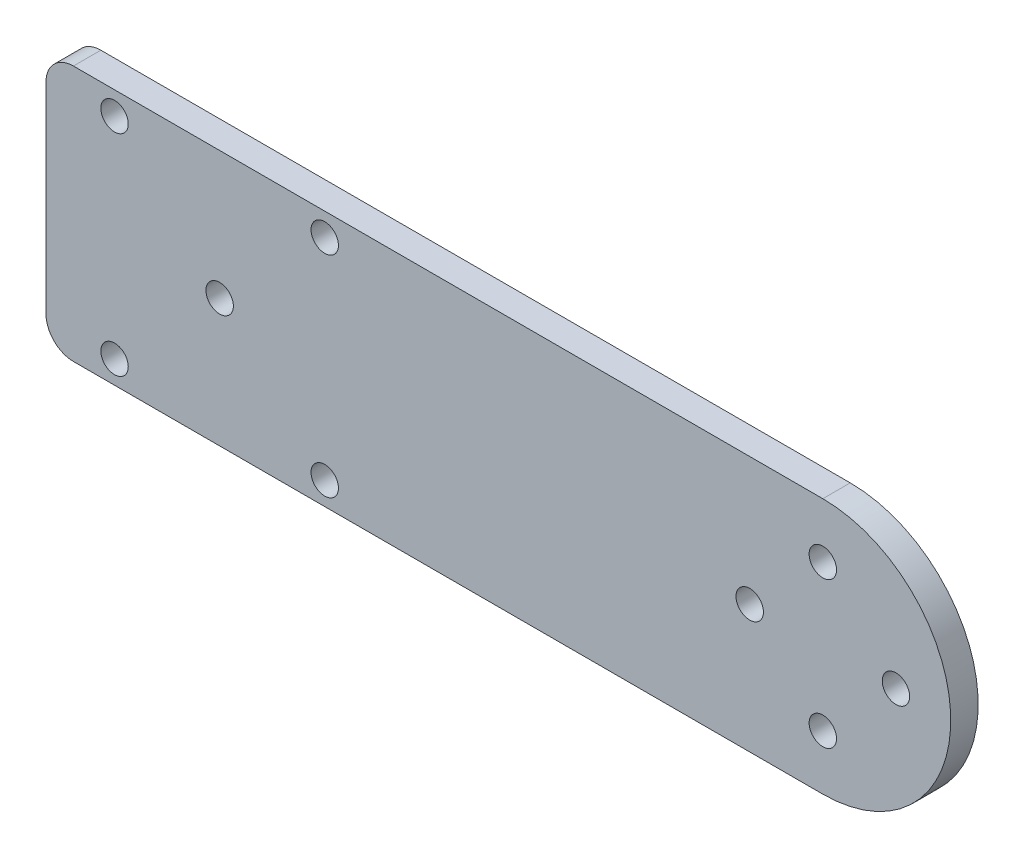
ISO-10303-21;
HEADER;
FILE_DESCRIPTION(('STEP AP214'),'2;1');
FILE_NAME('part.step','',(''),(''),'','','');
FILE_SCHEMA(('AUTOMOTIVE_DESIGN { 1 0 10303 214 1 1 1 1 }'));
ENDSEC;
DATA;
#1=APPLICATION_CONTEXT('core data for automotive mechanical design processes');
#2=APPLICATION_PROTOCOL_DEFINITION('international standard','automotive_design',2000,#1);
#3=PRODUCT_CONTEXT('',#1,'mechanical');
#4=PRODUCT('Part','Part','',(#3));
#5=PRODUCT_RELATED_PRODUCT_CATEGORY('part','',(#4));
#6=PRODUCT_DEFINITION_FORMATION('','',#4);
#7=PRODUCT_DEFINITION_CONTEXT('part definition',#1,'design');
#8=PRODUCT_DEFINITION('design','',#6,#7);
#9=PRODUCT_DEFINITION_SHAPE('','',#8);
#10=(LENGTH_UNIT() NAMED_UNIT(*) SI_UNIT(.MILLI.,.METRE.));
#11=(NAMED_UNIT(*) PLANE_ANGLE_UNIT() SI_UNIT($,.RADIAN.));
#12=(NAMED_UNIT(*) SI_UNIT($,.STERADIAN.) SOLID_ANGLE_UNIT());
#13=UNCERTAINTY_MEASURE_WITH_UNIT(LENGTH_MEASURE(1.E-05),#10,'distance_accuracy_value','');
#14=(GEOMETRIC_REPRESENTATION_CONTEXT(3) GLOBAL_UNCERTAINTY_ASSIGNED_CONTEXT((#13)) GLOBAL_UNIT_ASSIGNED_CONTEXT((#10,
#11,#12)) REPRESENTATION_CONTEXT('',''));
#15=CARTESIAN_POINT('',(0.,0.,0.));
#16=DIRECTION('',(0.,0.,1.));
#17=DIRECTION('',(1.,0.,0.));
#18=AXIS2_PLACEMENT_3D('',#15,#16,#17);
#19=CARTESIAN_POINT('',(0.,-14.,3.));
#20=DIRECTION('',(0.,-1.,0.));
#21=DIRECTION('',(1.,0.,0.));
#22=AXIS2_PLACEMENT_3D('',#19,#20,#21);
#23=PLANE('',#22);
#24=DIRECTION('',(-1.,0.,0.));
#25=VECTOR('',#24,1.);
#26=CARTESIAN_POINT('',(0.,-14.,3.));
#27=LINE('',#26,#25);
#28=CARTESIAN_POINT('',(0.,-14.,3.));
#29=VERTEX_POINT('',#28);
#30=CARTESIAN_POINT('',(-82.,-14.,3.));
#31=VERTEX_POINT('',#30);
#32=EDGE_CURVE('E124',#29,#31,#27,.T.);
#33=ORIENTED_EDGE('',*,*,#32,.T.);
#34=DIRECTION('',(0.,0.,-1.));
#35=VECTOR('',#34,1.);
#36=CARTESIAN_POINT('',(-82.,-14.,0.));
#37=LINE('',#36,#35);
#38=CARTESIAN_POINT('',(-82.,-14.,0.));
#39=VERTEX_POINT('',#38);
#40=EDGE_CURVE('E132',#31,#39,#37,.T.);
#41=ORIENTED_EDGE('',*,*,#40,.T.);
#42=DIRECTION('',(-1.,0.,0.));
#43=VECTOR('',#42,1.);
#44=CARTESIAN_POINT('',(0.,-14.,0.));
#45=LINE('',#44,#43);
#46=CARTESIAN_POINT('',(0.,-14.,0.));
#47=VERTEX_POINT('',#46);
#48=EDGE_CURVE('E127',#47,#39,#45,.T.);
#49=ORIENTED_EDGE('',*,*,#48,.F.);
#50=DIRECTION('',(0.,0.,-1.));
#51=VECTOR('',#50,1.);
#52=CARTESIAN_POINT('',(0.,-14.,3.));
#53=LINE('',#52,#51);
#54=EDGE_CURVE('E120',#29,#47,#53,.T.);
#55=ORIENTED_EDGE('',*,*,#54,.F.);
#56=EDGE_LOOP('',(#33,#41,#49,#55));
#57=FACE_BOUND('',#56,.T.);
#58=ADVANCED_FACE('F65',(#57),#23,.T.);
#59=CARTESIAN_POINT('',(0.,0.,3.));
#60=DIRECTION('',(0.,0.,-1.));
#61=DIRECTION('',(-1.,0.,0.));
#62=AXIS2_PLACEMENT_3D('',#59,#60,#61);
#63=CYLINDRICAL_SURFACE('',#62,14.);
#64=CARTESIAN_POINT('',(0.,0.,0.));
#65=DIRECTION('',(0.,0.,1.));
#66=DIRECTION('',(1.,0.,0.));
#67=AXIS2_PLACEMENT_3D('',#64,#65,#66);
#68=CIRCLE('',#67,14.);
#69=CARTESIAN_POINT('',(0.,14.,0.));
#70=VERTEX_POINT('',#69);
#71=EDGE_CURVE('E197',#47,#70,#68,.T.);
#72=ORIENTED_EDGE('',*,*,#71,.T.);
#73=DIRECTION('',(0.,0.,-1.));
#74=VECTOR('',#73,1.);
#75=CARTESIAN_POINT('',(0.,14.,3.));
#76=LINE('',#75,#74);
#77=CARTESIAN_POINT('',(0.,14.,3.));
#78=VERTEX_POINT('',#77);
#79=EDGE_CURVE('E133',#78,#70,#76,.T.);
#80=ORIENTED_EDGE('',*,*,#79,.F.);
#81=CARTESIAN_POINT('',(0.,0.,3.));
#82=DIRECTION('',(0.,0.,1.));
#83=DIRECTION('',(1.,0.,0.));
#84=AXIS2_PLACEMENT_3D('',#81,#82,#83);
#85=CIRCLE('',#84,14.);
#86=EDGE_CURVE('E137',#29,#78,#85,.T.);
#87=ORIENTED_EDGE('',*,*,#86,.F.);
#88=ORIENTED_EDGE('',*,*,#54,.T.);
#89=EDGE_LOOP('',(#72,#80,#87,#88));
#90=FACE_BOUND('',#89,.T.);
#91=ADVANCED_FACE('F138',(#90),#63,.T.);
#92=CARTESIAN_POINT('',(0.,14.,3.));
#93=DIRECTION('',(0.,-1.,0.));
#94=DIRECTION('',(1.,0.,0.));
#95=AXIS2_PLACEMENT_3D('',#92,#93,#94);
#96=PLANE('',#95);
#97=DIRECTION('',(-1.,0.,0.));
#98=VECTOR('',#97,1.);
#99=CARTESIAN_POINT('',(0.,14.,0.));
#100=LINE('',#99,#98);
#101=CARTESIAN_POINT('',(-82.,14.,0.));
#102=VERTEX_POINT('',#101);
#103=EDGE_CURVE('E200',#70,#102,#100,.T.);
#104=ORIENTED_EDGE('',*,*,#103,.T.);
#105=DIRECTION('',(0.,0.,-1.));
#106=VECTOR('',#105,1.);
#107=CARTESIAN_POINT('',(-82.,14.,3.));
#108=LINE('',#107,#106);
#109=CARTESIAN_POINT('',(-82.,14.,3.));
#110=VERTEX_POINT('',#109);
#111=EDGE_CURVE('E12',#102,#110,#108,.F.);
#112=ORIENTED_EDGE('',*,*,#111,.T.);
#113=DIRECTION('',(-1.,0.,0.));
#114=VECTOR('',#113,1.);
#115=CARTESIAN_POINT('',(0.,14.,3.));
#116=LINE('',#115,#114);
#117=EDGE_CURVE('E142',#78,#110,#116,.T.);
#118=ORIENTED_EDGE('',*,*,#117,.F.);
#119=ORIENTED_EDGE('',*,*,#79,.T.);
#120=EDGE_LOOP('',(#104,#112,#118,#119));
#121=FACE_BOUND('',#120,.T.);
#122=ADVANCED_FACE('F260',(#121),#96,.F.);
#123=CARTESIAN_POINT('',(-77.5,-11.5,3.));
#124=DIRECTION('',(0.,0.,-1.));
#125=DIRECTION('',(-1.,0.,0.));
#126=AXIS2_PLACEMENT_3D('',#123,#124,#125);
#127=CYLINDRICAL_SURFACE('',#126,1.5);
#128=CARTESIAN_POINT('',(-77.5,-11.5,3.));
#129=DIRECTION('',(0.,0.,1.));
#130=DIRECTION('',(1.,0.,0.));
#131=AXIS2_PLACEMENT_3D('',#128,#129,#130);
#132=CIRCLE('',#131,1.5);
#133=CARTESIAN_POINT('',(-76.,-11.5,3.));
#134=VERTEX_POINT('',#133);
#135=EDGE_CURVE('E174',#134,#134,#132,.T.);
#136=ORIENTED_EDGE('',*,*,#135,.T.);
#137=EDGE_LOOP('',(#136));
#138=FACE_BOUND('',#137,.T.);
#139=CARTESIAN_POINT('',(-77.5,-11.5,0.));
#140=DIRECTION('',(0.,0.,1.));
#141=DIRECTION('',(1.,0.,0.));
#142=AXIS2_PLACEMENT_3D('',#139,#140,#141);
#143=CIRCLE('',#142,1.5);
#144=CARTESIAN_POINT('',(-76.,-11.5,0.));
#145=VERTEX_POINT('',#144);
#146=EDGE_CURVE('E219',#145,#145,#143,.T.);
#147=ORIENTED_EDGE('',*,*,#146,.F.);
#148=EDGE_LOOP('',(#147));
#149=FACE_BOUND('',#148,.T.);
#150=ADVANCED_FACE('F284',(#138,#149),#127,.F.);
#151=CARTESIAN_POINT('',(-54.5,11.5,3.));
#152=DIRECTION('',(0.,0.,-1.));
#153=DIRECTION('',(-1.,0.,0.));
#154=AXIS2_PLACEMENT_3D('',#151,#152,#153);
#155=CYLINDRICAL_SURFACE('',#154,1.5);
#156=CARTESIAN_POINT('',(-54.5,11.5,3.));
#157=DIRECTION('',(0.,0.,1.));
#158=DIRECTION('',(1.,0.,0.));
#159=AXIS2_PLACEMENT_3D('',#156,#157,#158);
#160=CIRCLE('',#159,1.5);
#161=CARTESIAN_POINT('',(-53.,11.5,3.));
#162=VERTEX_POINT('',#161);
#163=EDGE_CURVE('E170',#162,#162,#160,.T.);
#164=ORIENTED_EDGE('',*,*,#163,.T.);
#165=EDGE_LOOP('',(#164));
#166=FACE_BOUND('',#165,.T.);
#167=CARTESIAN_POINT('',(-54.5,11.5,0.));
#168=DIRECTION('',(0.,0.,1.));
#169=DIRECTION('',(1.,0.,0.));
#170=AXIS2_PLACEMENT_3D('',#167,#168,#169);
#171=CIRCLE('',#170,1.5);
#172=CARTESIAN_POINT('',(-53.,11.5,0.));
#173=VERTEX_POINT('',#172);
#174=EDGE_CURVE('E215',#173,#173,#171,.T.);
#175=ORIENTED_EDGE('',*,*,#174,.F.);
#176=EDGE_LOOP('',(#175));
#177=FACE_BOUND('',#176,.T.);
#178=ADVANCED_FACE('F287',(#166,#177),#155,.F.);
#179=CARTESIAN_POINT('',(-54.5,-11.5,3.));
#180=DIRECTION('',(0.,0.,-1.));
#181=DIRECTION('',(-1.,0.,0.));
#182=AXIS2_PLACEMENT_3D('',#179,#180,#181);
#183=CYLINDRICAL_SURFACE('',#182,1.5);
#184=CARTESIAN_POINT('',(-54.5,-11.5,3.));
#185=DIRECTION('',(0.,0.,1.));
#186=DIRECTION('',(1.,0.,0.));
#187=AXIS2_PLACEMENT_3D('',#184,#185,#186);
#188=CIRCLE('',#187,1.5);
#189=CARTESIAN_POINT('',(-53.,-11.5,3.));
#190=VERTEX_POINT('',#189);
#191=EDGE_CURVE('E166',#190,#190,#188,.T.);
#192=ORIENTED_EDGE('',*,*,#191,.T.);
#193=EDGE_LOOP('',(#192));
#194=FACE_BOUND('',#193,.T.);
#195=CARTESIAN_POINT('',(-54.5,-11.5,0.));
#196=DIRECTION('',(0.,0.,1.));
#197=DIRECTION('',(1.,0.,0.));
#198=AXIS2_PLACEMENT_3D('',#195,#196,#197);
#199=CIRCLE('',#198,1.5);
#200=CARTESIAN_POINT('',(-53.,-11.5,0.));
#201=VERTEX_POINT('',#200);
#202=EDGE_CURVE('E211',#201,#201,#199,.T.);
#203=ORIENTED_EDGE('',*,*,#202,.F.);
#204=EDGE_LOOP('',(#203));
#205=FACE_BOUND('',#204,.T.);
#206=ADVANCED_FACE('F291',(#194,#205),#183,.F.);
#207=CARTESIAN_POINT('',(-66.,0.,3.));
#208=DIRECTION('',(0.,0.,-1.));
#209=DIRECTION('',(-1.,0.,0.));
#210=AXIS2_PLACEMENT_3D('',#207,#208,#209);
#211=CYLINDRICAL_SURFACE('',#210,1.5);
#212=CARTESIAN_POINT('',(-66.,0.,3.));
#213=DIRECTION('',(0.,0.,1.));
#214=DIRECTION('',(1.,0.,0.));
#215=AXIS2_PLACEMENT_3D('',#212,#213,#214);
#216=CIRCLE('',#215,1.5);
#217=CARTESIAN_POINT('',(-64.5,0.,3.));
#218=VERTEX_POINT('',#217);
#219=EDGE_CURVE('E162',#218,#218,#216,.T.);
#220=ORIENTED_EDGE('',*,*,#219,.T.);
#221=EDGE_LOOP('',(#220));
#222=FACE_BOUND('',#221,.T.);
#223=CARTESIAN_POINT('',(-66.,0.,0.));
#224=DIRECTION('',(0.,0.,1.));
#225=DIRECTION('',(1.,0.,0.));
#226=AXIS2_PLACEMENT_3D('',#223,#224,#225);
#227=CIRCLE('',#226,1.5);
#228=CARTESIAN_POINT('',(-64.5,0.,0.));
#229=VERTEX_POINT('',#228);
#230=EDGE_CURVE('E207',#229,#229,#227,.T.);
#231=ORIENTED_EDGE('',*,*,#230,.F.);
#232=EDGE_LOOP('',(#231));
#233=FACE_BOUND('',#232,.T.);
#234=ADVANCED_FACE('F295',(#222,#233),#211,.F.);
#235=CARTESIAN_POINT('',(0.,8.,3.));
#236=DIRECTION('',(0.,0.,-1.));
#237=DIRECTION('',(-1.,0.,0.));
#238=AXIS2_PLACEMENT_3D('',#235,#236,#237);
#239=CYLINDRICAL_SURFACE('',#238,1.5);
#240=CARTESIAN_POINT('',(0.,8.,3.));
#241=DIRECTION('',(0.,0.,1.));
#242=DIRECTION('',(1.,0.,0.));
#243=AXIS2_PLACEMENT_3D('',#240,#241,#242);
#244=CIRCLE('',#243,1.5);
#245=CARTESIAN_POINT('',(1.5,8.,3.));
#246=VERTEX_POINT('',#245);
#247=EDGE_CURVE('E158',#246,#246,#244,.T.);
#248=ORIENTED_EDGE('',*,*,#247,.T.);
#249=EDGE_LOOP('',(#248));
#250=FACE_BOUND('',#249,.T.);
#251=CARTESIAN_POINT('',(0.,8.,0.));
#252=DIRECTION('',(0.,0.,1.));
#253=DIRECTION('',(1.,0.,0.));
#254=AXIS2_PLACEMENT_3D('',#251,#252,#253);
#255=CIRCLE('',#254,1.5);
#256=CARTESIAN_POINT('',(1.5,8.,0.));
#257=VERTEX_POINT('',#256);
#258=EDGE_CURVE('E203',#257,#257,#255,.T.);
#259=ORIENTED_EDGE('',*,*,#258,.F.);
#260=EDGE_LOOP('',(#259));
#261=FACE_BOUND('',#260,.T.);
#262=ADVANCED_FACE('F299',(#250,#261),#239,.F.);
#263=CARTESIAN_POINT('',(-8.,0.,3.));
#264=DIRECTION('',(0.,0.,-1.));
#265=DIRECTION('',(-1.,0.,0.));
#266=AXIS2_PLACEMENT_3D('',#263,#264,#265);
#267=CYLINDRICAL_SURFACE('',#266,1.5);
#268=CARTESIAN_POINT('',(-8.,0.,3.));
#269=DIRECTION('',(0.,0.,1.));
#270=DIRECTION('',(1.,0.,0.));
#271=AXIS2_PLACEMENT_3D('',#268,#269,#270);
#272=CIRCLE('',#271,1.5);
#273=CARTESIAN_POINT('',(-6.5,0.,3.));
#274=VERTEX_POINT('',#273);
#275=EDGE_CURVE('E148',#274,#274,#272,.T.);
#276=ORIENTED_EDGE('',*,*,#275,.T.);
#277=EDGE_LOOP('',(#276));
#278=FACE_BOUND('',#277,.T.);
#279=CARTESIAN_POINT('',(-8.,0.,0.));
#280=DIRECTION('',(0.,0.,1.));
#281=DIRECTION('',(1.,0.,0.));
#282=AXIS2_PLACEMENT_3D('',#279,#280,#281);
#283=CIRCLE('',#282,1.5);
#284=CARTESIAN_POINT('',(-6.5,0.,0.));
#285=VERTEX_POINT('',#284);
#286=EDGE_CURVE('E191',#285,#285,#283,.T.);
#287=ORIENTED_EDGE('',*,*,#286,.F.);
#288=EDGE_LOOP('',(#287));
#289=FACE_BOUND('',#288,.T.);
#290=ADVANCED_FACE('F303',(#278,#289),#267,.F.);
#291=CARTESIAN_POINT('',(0.,-8.,3.));
#292=DIRECTION('',(0.,0.,-1.));
#293=DIRECTION('',(-1.,0.,0.));
#294=AXIS2_PLACEMENT_3D('',#291,#292,#293);
#295=CYLINDRICAL_SURFACE('',#294,1.5);
#296=CARTESIAN_POINT('',(0.,-8.,3.));
#297=DIRECTION('',(0.,0.,1.));
#298=DIRECTION('',(1.,0.,0.));
#299=AXIS2_PLACEMENT_3D('',#296,#297,#298);
#300=CIRCLE('',#299,1.5);
#301=CARTESIAN_POINT('',(1.5,-8.,3.));
#302=VERTEX_POINT('',#301);
#303=EDGE_CURVE('E152',#302,#302,#300,.T.);
#304=ORIENTED_EDGE('',*,*,#303,.T.);
#305=EDGE_LOOP('',(#304));
#306=FACE_BOUND('',#305,.T.);
#307=CARTESIAN_POINT('',(0.,-8.,0.));
#308=DIRECTION('',(0.,0.,1.));
#309=DIRECTION('',(1.,0.,0.));
#310=AXIS2_PLACEMENT_3D('',#307,#308,#309);
#311=CIRCLE('',#310,1.5);
#312=CARTESIAN_POINT('',(1.5,-8.,0.));
#313=VERTEX_POINT('',#312);
#314=EDGE_CURVE('E186',#313,#313,#311,.T.);
#315=ORIENTED_EDGE('',*,*,#314,.F.);
#316=EDGE_LOOP('',(#315));
#317=FACE_BOUND('',#316,.T.);
#318=ADVANCED_FACE('F313',(#306,#317),#295,.F.);
#319=CARTESIAN_POINT('',(8.,0.,3.));
#320=DIRECTION('',(0.,0.,-1.));
#321=DIRECTION('',(-1.,0.,0.));
#322=AXIS2_PLACEMENT_3D('',#319,#320,#321);
#323=CYLINDRICAL_SURFACE('',#322,1.5);
#324=CARTESIAN_POINT('',(8.,0.,3.));
#325=DIRECTION('',(0.,0.,1.));
#326=DIRECTION('',(1.,0.,0.));
#327=AXIS2_PLACEMENT_3D('',#324,#325,#326);
#328=CIRCLE('',#327,1.5);
#329=CARTESIAN_POINT('',(9.5,0.,3.));
#330=VERTEX_POINT('',#329);
#331=EDGE_CURVE('E227',#330,#330,#328,.T.);
#332=ORIENTED_EDGE('',*,*,#331,.T.);
#333=EDGE_LOOP('',(#332));
#334=FACE_BOUND('',#333,.T.);
#335=CARTESIAN_POINT('',(8.,0.,0.));
#336=DIRECTION('',(0.,0.,1.));
#337=DIRECTION('',(1.,0.,0.));
#338=AXIS2_PLACEMENT_3D('',#335,#336,#337);
#339=CIRCLE('',#338,1.5);
#340=CARTESIAN_POINT('',(9.5,0.,0.));
#341=VERTEX_POINT('',#340);
#342=EDGE_CURVE('E182',#341,#341,#339,.T.);
#343=ORIENTED_EDGE('',*,*,#342,.F.);
#344=EDGE_LOOP('',(#343));
#345=FACE_BOUND('',#344,.T.);
#346=ADVANCED_FACE('F282',(#334,#345),#323,.F.);
#347=CARTESIAN_POINT('',(-77.5,11.5,3.));
#348=DIRECTION('',(0.,0.,-1.));
#349=DIRECTION('',(-1.,0.,0.));
#350=AXIS2_PLACEMENT_3D('',#347,#348,#349);
#351=CYLINDRICAL_SURFACE('',#350,1.5);
#352=CARTESIAN_POINT('',(-77.5,11.5,3.));
#353=DIRECTION('',(0.,0.,1.));
#354=DIRECTION('',(1.,0.,0.));
#355=AXIS2_PLACEMENT_3D('',#352,#353,#354);
#356=CIRCLE('',#355,1.5);
#357=CARTESIAN_POINT('',(-76.,11.5,3.));
#358=VERTEX_POINT('',#357);
#359=EDGE_CURVE('E178',#358,#358,#356,.T.);
#360=ORIENTED_EDGE('',*,*,#359,.T.);
#361=EDGE_LOOP('',(#360));
#362=FACE_BOUND('',#361,.T.);
#363=CARTESIAN_POINT('',(-77.5,11.5,0.));
#364=DIRECTION('',(0.,0.,1.));
#365=DIRECTION('',(1.,0.,0.));
#366=AXIS2_PLACEMENT_3D('',#363,#364,#365);
#367=CIRCLE('',#366,1.5);
#368=CARTESIAN_POINT('',(-76.,11.5,0.));
#369=VERTEX_POINT('',#368);
#370=EDGE_CURVE('E223',#369,#369,#367,.T.);
#371=ORIENTED_EDGE('',*,*,#370,.F.);
#372=EDGE_LOOP('',(#371));
#373=FACE_BOUND('',#372,.T.);
#374=ADVANCED_FACE('F275',(#362,#373),#351,.F.);
#375=CARTESIAN_POINT('',(0.,0.,3.));
#376=DIRECTION('',(0.,0.,1.));
#377=DIRECTION('',(1.,0.,0.));
#378=AXIS2_PLACEMENT_3D('',#375,#376,#377);
#379=PLANE('',#378);
#380=ORIENTED_EDGE('',*,*,#331,.F.);
#381=EDGE_LOOP('',(#380));
#382=FACE_BOUND('',#381,.T.);
#383=ORIENTED_EDGE('',*,*,#303,.F.);
#384=EDGE_LOOP('',(#383));
#385=FACE_BOUND('',#384,.T.);
#386=ORIENTED_EDGE('',*,*,#275,.F.);
#387=EDGE_LOOP('',(#386));
#388=FACE_BOUND('',#387,.T.);
#389=DIRECTION('',(0.,-1.,0.));
#390=VECTOR('',#389,1.);
#391=CARTESIAN_POINT('',(-85.,14.,3.));
#392=LINE('',#391,#390);
#393=CARTESIAN_POINT('',(-85.,11.,3.));
#394=VERTEX_POINT('',#393);
#395=CARTESIAN_POINT('',(-85.,-11.,3.));
#396=VERTEX_POINT('',#395);
#397=EDGE_CURVE('E187',#394,#396,#392,.T.);
#398=ORIENTED_EDGE('',*,*,#397,.T.);
#399=CARTESIAN_POINT('',(-82.,-11.,3.));
#400=DIRECTION('',(0.,0.,1.));
#401=DIRECTION('',(1.,0.,0.));
#402=AXIS2_PLACEMENT_3D('',#399,#400,#401);
#403=CIRCLE('',#402,3.);
#404=EDGE_CURVE('E74',#396,#31,#403,.T.);
#405=ORIENTED_EDGE('',*,*,#404,.T.);
#406=ORIENTED_EDGE('',*,*,#32,.F.);
#407=ORIENTED_EDGE('',*,*,#86,.T.);
#408=ORIENTED_EDGE('',*,*,#117,.T.);
#409=CARTESIAN_POINT('',(-82.,11.,3.));
#410=DIRECTION('',(0.,0.,1.));
#411=DIRECTION('',(1.,0.,0.));
#412=AXIS2_PLACEMENT_3D('',#409,#410,#411);
#413=CIRCLE('',#412,3.);
#414=EDGE_CURVE('E249',#110,#394,#413,.T.);
#415=ORIENTED_EDGE('',*,*,#414,.T.);
#416=EDGE_LOOP('',(#398,#405,#406,#407,#408,#415));
#417=FACE_BOUND('',#416,.T.);
#418=ORIENTED_EDGE('',*,*,#247,.F.);
#419=EDGE_LOOP('',(#418));
#420=FACE_BOUND('',#419,.T.);
#421=ORIENTED_EDGE('',*,*,#219,.F.);
#422=EDGE_LOOP('',(#421));
#423=FACE_BOUND('',#422,.T.);
#424=ORIENTED_EDGE('',*,*,#191,.F.);
#425=EDGE_LOOP('',(#424));
#426=FACE_BOUND('',#425,.T.);
#427=ORIENTED_EDGE('',*,*,#163,.F.);
#428=EDGE_LOOP('',(#427));
#429=FACE_BOUND('',#428,.T.);
#430=ORIENTED_EDGE('',*,*,#135,.F.);
#431=EDGE_LOOP('',(#430));
#432=FACE_BOUND('',#431,.T.);
#433=ORIENTED_EDGE('',*,*,#359,.F.);
#434=EDGE_LOOP('',(#433));
#435=FACE_BOUND('',#434,.T.);
#436=ADVANCED_FACE('F144',(#382,#385,#388,#417,#420,#423,#426,#429,#432,#435),#379,.T.);
#437=CARTESIAN_POINT('',(0.,0.,0.));
#438=DIRECTION('',(0.,0.,1.));
#439=DIRECTION('',(1.,0.,0.));
#440=AXIS2_PLACEMENT_3D('',#437,#438,#439);
#441=PLANE('',#440);
#442=ORIENTED_EDGE('',*,*,#342,.T.);
#443=EDGE_LOOP('',(#442));
#444=FACE_BOUND('',#443,.T.);
#445=ORIENTED_EDGE('',*,*,#314,.T.);
#446=EDGE_LOOP('',(#445));
#447=FACE_BOUND('',#446,.T.);
#448=ORIENTED_EDGE('',*,*,#286,.T.);
#449=EDGE_LOOP('',(#448));
#450=FACE_BOUND('',#449,.T.);
#451=ORIENTED_EDGE('',*,*,#48,.T.);
#452=CARTESIAN_POINT('',(-82.,-11.,0.));
#453=DIRECTION('',(0.,0.,1.));
#454=DIRECTION('',(1.,0.,0.));
#455=AXIS2_PLACEMENT_3D('',#452,#453,#454);
#456=CIRCLE('',#455,3.);
#457=CARTESIAN_POINT('',(-85.,-11.,0.));
#458=VERTEX_POINT('',#457);
#459=EDGE_CURVE('E240',#39,#458,#456,.F.);
#460=ORIENTED_EDGE('',*,*,#459,.T.);
#461=DIRECTION('',(0.,-1.,0.));
#462=VECTOR('',#461,1.);
#463=CARTESIAN_POINT('',(-85.,14.,0.));
#464=LINE('',#463,#462);
#465=CARTESIAN_POINT('',(-85.,11.,0.));
#466=VERTEX_POINT('',#465);
#467=EDGE_CURVE('E232',#466,#458,#464,.T.);
#468=ORIENTED_EDGE('',*,*,#467,.F.);
#469=CARTESIAN_POINT('',(-82.,11.,0.));
#470=DIRECTION('',(0.,0.,1.));
#471=DIRECTION('',(1.,0.,0.));
#472=AXIS2_PLACEMENT_3D('',#469,#470,#471);
#473=CIRCLE('',#472,3.);
#474=EDGE_CURVE('E237',#466,#102,#473,.F.);
#475=ORIENTED_EDGE('',*,*,#474,.T.);
#476=ORIENTED_EDGE('',*,*,#103,.F.);
#477=ORIENTED_EDGE('',*,*,#71,.F.);
#478=EDGE_LOOP('',(#451,#460,#468,#475,#476,#477));
#479=FACE_BOUND('',#478,.T.);
#480=ORIENTED_EDGE('',*,*,#258,.T.);
#481=EDGE_LOOP('',(#480));
#482=FACE_BOUND('',#481,.T.);
#483=ORIENTED_EDGE('',*,*,#230,.T.);
#484=EDGE_LOOP('',(#483));
#485=FACE_BOUND('',#484,.T.);
#486=ORIENTED_EDGE('',*,*,#202,.T.);
#487=EDGE_LOOP('',(#486));
#488=FACE_BOUND('',#487,.T.);
#489=ORIENTED_EDGE('',*,*,#174,.T.);
#490=EDGE_LOOP('',(#489));
#491=FACE_BOUND('',#490,.T.);
#492=ORIENTED_EDGE('',*,*,#146,.T.);
#493=EDGE_LOOP('',(#492));
#494=FACE_BOUND('',#493,.T.);
#495=ORIENTED_EDGE('',*,*,#370,.T.);
#496=EDGE_LOOP('',(#495));
#497=FACE_BOUND('',#496,.T.);
#498=ADVANCED_FACE('F258',(#444,#447,#450,#479,#482,#485,#488,#491,#494,#497),#441,.F.);
#499=CARTESIAN_POINT('',(-85.,14.,3.));
#500=DIRECTION('',(1.,0.,0.));
#501=DIRECTION('',(0.,0.,-1.));
#502=AXIS2_PLACEMENT_3D('',#499,#500,#501);
#503=PLANE('',#502);
#504=ORIENTED_EDGE('',*,*,#467,.T.);
#505=DIRECTION('',(0.,0.,-1.));
#506=VECTOR('',#505,1.);
#507=CARTESIAN_POINT('',(-85.,-11.,3.));
#508=LINE('',#507,#506);
#509=EDGE_CURVE('E87',#458,#396,#508,.F.);
#510=ORIENTED_EDGE('',*,*,#509,.T.);
#511=ORIENTED_EDGE('',*,*,#397,.F.);
#512=DIRECTION('',(0.,0.,-1.));
#513=VECTOR('',#512,1.);
#514=CARTESIAN_POINT('',(-85.,11.,3.));
#515=LINE('',#514,#513);
#516=EDGE_CURVE('E243',#394,#466,#515,.T.);
#517=ORIENTED_EDGE('',*,*,#516,.T.);
#518=EDGE_LOOP('',(#504,#510,#511,#517));
#519=FACE_BOUND('',#518,.T.);
#520=ADVANCED_FACE('F255',(#519),#503,.F.);
#521=CARTESIAN_POINT('',(-82.,-11.,3.));
#522=DIRECTION('',(0.,0.,1.));
#523=DIRECTION('',(1.,0.,0.));
#524=AXIS2_PLACEMENT_3D('',#521,#522,#523);
#525=CYLINDRICAL_SURFACE('',#524,3.);
#526=ORIENTED_EDGE('',*,*,#404,.F.);
#527=ORIENTED_EDGE('',*,*,#509,.F.);
#528=ORIENTED_EDGE('',*,*,#459,.F.);
#529=ORIENTED_EDGE('',*,*,#40,.F.);
#530=EDGE_LOOP('',(#526,#527,#528,#529));
#531=FACE_BOUND('',#530,.T.);
#532=ADVANCED_FACE('F262',(#531),#525,.T.);
#533=CARTESIAN_POINT('',(-82.,11.,3.));
#534=DIRECTION('',(0.,0.,-1.));
#535=DIRECTION('',(-1.,0.,0.));
#536=AXIS2_PLACEMENT_3D('',#533,#534,#535);
#537=CYLINDRICAL_SURFACE('',#536,3.);
#538=ORIENTED_EDGE('',*,*,#414,.F.);
#539=ORIENTED_EDGE('',*,*,#111,.F.);
#540=ORIENTED_EDGE('',*,*,#474,.F.);
#541=ORIENTED_EDGE('',*,*,#516,.F.);
#542=EDGE_LOOP('',(#538,#539,#540,#541));
#543=FACE_BOUND('',#542,.T.);
#544=ADVANCED_FACE('F67',(#543),#537,.T.);
#545=CLOSED_SHELL('',(#58,#91,#122,#150,#178,#206,#234,#262,#290,#318,#346,#374,#436,#498,#520,
#532,#544));
#546=MANIFOLD_SOLID_BREP('B2',#545);
#547=ADVANCED_BREP_SHAPE_REPRESENTATION('',(#18,#546),#14);
#548=SHAPE_DEFINITION_REPRESENTATION(#9,#547);
ENDSEC;
END-ISO-10303-21;
